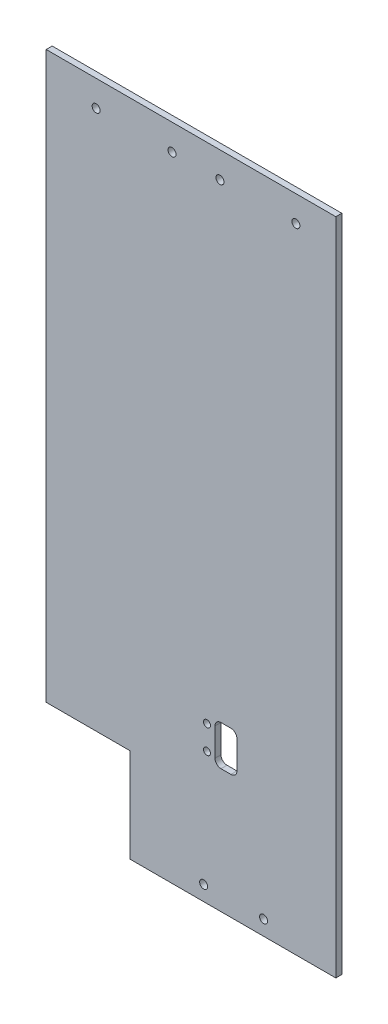
ISO-10303-21;
HEADER;
FILE_DESCRIPTION(('STEP AP214'),'2;1');
FILE_NAME('part.step','',(''),(''),'','','');
FILE_SCHEMA(('AUTOMOTIVE_DESIGN { 1 0 10303 214 1 1 1 1 }'));
ENDSEC;
DATA;
#1=APPLICATION_CONTEXT('core data for automotive mechanical design processes');
#2=APPLICATION_PROTOCOL_DEFINITION('international standard','automotive_design',2000,#1);
#3=PRODUCT_CONTEXT('',#1,'mechanical');
#4=PRODUCT('Part','Part','',(#3));
#5=PRODUCT_RELATED_PRODUCT_CATEGORY('part','',(#4));
#6=PRODUCT_DEFINITION_FORMATION('','',#4);
#7=PRODUCT_DEFINITION_CONTEXT('part definition',#1,'design');
#8=PRODUCT_DEFINITION('design','',#6,#7);
#9=PRODUCT_DEFINITION_SHAPE('','',#8);
#10=(LENGTH_UNIT() NAMED_UNIT(*) SI_UNIT(.MILLI.,.METRE.));
#11=(NAMED_UNIT(*) PLANE_ANGLE_UNIT() SI_UNIT($,.RADIAN.));
#12=(NAMED_UNIT(*) SI_UNIT($,.STERADIAN.) SOLID_ANGLE_UNIT());
#13=UNCERTAINTY_MEASURE_WITH_UNIT(LENGTH_MEASURE(1.E-05),#10,'distance_accuracy_value','');
#14=(GEOMETRIC_REPRESENTATION_CONTEXT(3) GLOBAL_UNCERTAINTY_ASSIGNED_CONTEXT((#13)) GLOBAL_UNIT_ASSIGNED_CONTEXT((#10,
#11,#12)) REPRESENTATION_CONTEXT('',''));
#15=CARTESIAN_POINT('',(0.,0.,0.));
#16=DIRECTION('',(0.,0.,1.));
#17=DIRECTION('',(1.,0.,0.));
#18=AXIS2_PLACEMENT_3D('',#15,#16,#17);
#19=CARTESIAN_POINT('',(-37.546991932126,-59.8387133322413,3.));
#20=DIRECTION('',(0.,1.,0.));
#21=DIRECTION('',(0.,0.,1.));
#22=AXIS2_PLACEMENT_3D('',#19,#20,#21);
#23=PLANE('',#22);
#24=DIRECTION('',(1.,0.,0.));
#25=VECTOR('',#24,1.);
#26=CARTESIAN_POINT('',(-37.546991932126,-59.8387133322413,3.));
#27=LINE('',#26,#25);
#28=CARTESIAN_POINT('',(14.4530080678726,-59.8387133322413,3.));
#29=VERTEX_POINT('',#28);
#30=CARTESIAN_POINT('',(117.453008067874,-59.8387133322413,3.));
#31=VERTEX_POINT('',#30);
#32=EDGE_CURVE('E227',#29,#31,#27,.T.);
#33=ORIENTED_EDGE('',*,*,#32,.F.);
#34=DIRECTION('',(0.,0.,1.));
#35=VECTOR('',#34,1.);
#36=CARTESIAN_POINT('',(14.4530080678726,-59.8387133322413,-7.));
#37=LINE('',#36,#35);
#38=CARTESIAN_POINT('',(14.4530080678726,-59.8387133322413,0.));
#39=VERTEX_POINT('',#38);
#40=EDGE_CURVE('E218',#39,#29,#37,.T.);
#41=ORIENTED_EDGE('',*,*,#40,.F.);
#42=DIRECTION('',(1.,0.,0.));
#43=VECTOR('',#42,1.);
#44=CARTESIAN_POINT('',(-37.546991932126,-59.8387133322413,0.));
#45=LINE('',#44,#43);
#46=CARTESIAN_POINT('',(117.453008067874,-59.8387133322413,0.));
#47=VERTEX_POINT('',#46);
#48=EDGE_CURVE('E220',#39,#47,#45,.T.);
#49=ORIENTED_EDGE('',*,*,#48,.T.);
#50=DIRECTION('',(0.,0.,-1.));
#51=VECTOR('',#50,1.);
#52=CARTESIAN_POINT('',(117.453008067874,-59.8387133322413,3.));
#53=LINE('',#52,#51);
#54=EDGE_CURVE('E243',#31,#47,#53,.T.);
#55=ORIENTED_EDGE('',*,*,#54,.F.);
#56=EDGE_LOOP('',(#33,#41,#49,#55));
#57=FACE_BOUND('',#56,.T.);
#58=ADVANCED_FACE('F33',(#57),#23,.F.);
#59=CARTESIAN_POINT('',(117.453008067874,270.161286667759,3.));
#60=DIRECTION('',(-1.,0.,0.));
#61=DIRECTION('',(0.,-1.,0.));
#62=AXIS2_PLACEMENT_3D('',#59,#60,#61);
#63=PLANE('',#62);
#64=DIRECTION('',(0.,1.,0.));
#65=VECTOR('',#64,1.);
#66=CARTESIAN_POINT('',(117.453008067874,270.161286667759,0.));
#67=LINE('',#66,#65);
#68=CARTESIAN_POINT('',(117.453008067874,270.161286667759,0.));
#69=VERTEX_POINT('',#68);
#70=EDGE_CURVE('E237',#47,#69,#67,.T.);
#71=ORIENTED_EDGE('',*,*,#70,.T.);
#72=DIRECTION('',(0.,0.,-1.));
#73=VECTOR('',#72,1.);
#74=CARTESIAN_POINT('',(117.453008067874,270.161286667759,3.));
#75=LINE('',#74,#73);
#76=CARTESIAN_POINT('',(117.453008067874,270.161286667759,3.));
#77=VERTEX_POINT('',#76);
#78=EDGE_CURVE('E235',#77,#69,#75,.T.);
#79=ORIENTED_EDGE('',*,*,#78,.F.);
#80=DIRECTION('',(0.,1.,0.));
#81=VECTOR('',#80,1.);
#82=CARTESIAN_POINT('',(117.453008067874,270.161286667759,3.));
#83=LINE('',#82,#81);
#84=EDGE_CURVE('E229',#31,#77,#83,.T.);
#85=ORIENTED_EDGE('',*,*,#84,.F.);
#86=ORIENTED_EDGE('',*,*,#54,.T.);
#87=EDGE_LOOP('',(#71,#79,#85,#86));
#88=FACE_BOUND('',#87,.T.);
#89=ADVANCED_FACE('F318',(#88),#63,.F.);
#90=CARTESIAN_POINT('',(-37.546991932126,270.161286667759,3.));
#91=DIRECTION('',(0.,-1.,0.));
#92=DIRECTION('',(0.,0.,-1.));
#93=AXIS2_PLACEMENT_3D('',#90,#91,#92);
#94=PLANE('',#93);
#95=DIRECTION('',(-1.,0.,0.));
#96=VECTOR('',#95,1.);
#97=CARTESIAN_POINT('',(-37.546991932126,270.161286667759,0.));
#98=LINE('',#97,#96);
#99=CARTESIAN_POINT('',(-27.546991932126,270.161286667759,0.));
#100=VERTEX_POINT('',#99);
#101=EDGE_CURVE('E230',#69,#100,#98,.T.);
#102=ORIENTED_EDGE('',*,*,#101,.T.);
#103=DIRECTION('',(0.,0.,1.));
#104=VECTOR('',#103,1.);
#105=CARTESIAN_POINT('',(-27.546991932126,270.161286667759,-7.));
#106=LINE('',#105,#104);
#107=CARTESIAN_POINT('',(-27.546991932126,270.161286667759,3.));
#108=VERTEX_POINT('',#107);
#109=EDGE_CURVE('E221',#100,#108,#106,.T.);
#110=ORIENTED_EDGE('',*,*,#109,.T.);
#111=DIRECTION('',(-1.,0.,0.));
#112=VECTOR('',#111,1.);
#113=CARTESIAN_POINT('',(-37.546991932126,270.161286667759,3.));
#114=LINE('',#113,#112);
#115=EDGE_CURVE('E232',#77,#108,#114,.T.);
#116=ORIENTED_EDGE('',*,*,#115,.F.);
#117=ORIENTED_EDGE('',*,*,#78,.T.);
#118=EDGE_LOOP('',(#102,#110,#116,#117));
#119=FACE_BOUND('',#118,.T.);
#120=ADVANCED_FACE('F323',(#119),#94,.F.);
#121=CARTESIAN_POINT('',(0.,0.,3.));
#122=DIRECTION('',(0.,0.,1.));
#123=DIRECTION('',(1.,0.,0.));
#124=AXIS2_PLACEMENT_3D('',#121,#122,#123);
#125=PLANE('',#124);
#126=CARTESIAN_POINT('',(52.953008067874,6.16128666775862,3.));
#127=DIRECTION('',(0.,0.,1.));
#128=DIRECTION('',(1.,0.,0.));
#129=AXIS2_PLACEMENT_3D('',#126,#127,#128);
#130=CIRCLE('',#129,1.75000000000001);
#131=CARTESIAN_POINT('',(54.703008067874,6.16128666775862,3.));
#132=VERTEX_POINT('',#131);
#133=EDGE_CURVE('E173',#132,#132,#130,.T.);
#134=ORIENTED_EDGE('',*,*,#133,.F.);
#135=EDGE_LOOP('',(#134));
#136=FACE_BOUND('',#135,.T.);
#137=CARTESIAN_POINT('',(59.953008067874,5.16128666775862,3.));
#138=DIRECTION('',(0.,0.,1.));
#139=DIRECTION('',(1.,0.,0.));
#140=AXIS2_PLACEMENT_3D('',#137,#138,#139);
#141=CIRCLE('',#140,3.00000000000001);
#142=CARTESIAN_POINT('',(56.953008067874,5.16128666775862,3.));
#143=VERTEX_POINT('',#142);
#144=CARTESIAN_POINT('',(59.953008067874,2.16128666775862,3.));
#145=VERTEX_POINT('',#144);
#146=EDGE_CURVE('E48',#143,#145,#141,.T.);
#147=ORIENTED_EDGE('',*,*,#146,.F.);
#148=DIRECTION('',(0.,-1.,0.));
#149=VECTOR('',#148,1.);
#150=CARTESIAN_POINT('',(56.953008067874,5.16128666775862,3.));
#151=LINE('',#150,#149);
#152=CARTESIAN_POINT('',(56.953008067874,19.1612866677586,3.));
#153=VERTEX_POINT('',#152);
#154=EDGE_CURVE('E168',#153,#143,#151,.T.);
#155=ORIENTED_EDGE('',*,*,#154,.F.);
#156=CARTESIAN_POINT('',(59.953008067874,19.1612866677586,3.));
#157=DIRECTION('',(0.,0.,1.));
#158=DIRECTION('',(-1.,0.,0.));
#159=AXIS2_PLACEMENT_3D('',#156,#157,#158);
#160=CIRCLE('',#159,3.);
#161=CARTESIAN_POINT('',(59.953008067874,22.1612866677586,3.));
#162=VERTEX_POINT('',#161);
#163=EDGE_CURVE('E165',#162,#153,#160,.T.);
#164=ORIENTED_EDGE('',*,*,#163,.F.);
#165=DIRECTION('',(-1.,0.,0.));
#166=VECTOR('',#165,1.);
#167=CARTESIAN_POINT('',(59.953008067874,22.1612866677586,3.));
#168=LINE('',#167,#166);
#169=CARTESIAN_POINT('',(64.953008067874,22.1612866677586,3.));
#170=VERTEX_POINT('',#169);
#171=EDGE_CURVE('E162',#170,#162,#168,.T.);
#172=ORIENTED_EDGE('',*,*,#171,.F.);
#173=CARTESIAN_POINT('',(64.953008067874,19.1612866677586,3.));
#174=DIRECTION('',(0.,0.,1.));
#175=DIRECTION('',(1.,0.,0.));
#176=AXIS2_PLACEMENT_3D('',#173,#174,#175);
#177=CIRCLE('',#176,2.99999999999999);
#178=CARTESIAN_POINT('',(67.953008067874,19.1612866677586,3.));
#179=VERTEX_POINT('',#178);
#180=EDGE_CURVE('E156',#179,#170,#177,.T.);
#181=ORIENTED_EDGE('',*,*,#180,.F.);
#182=DIRECTION('',(0.,1.,0.));
#183=VECTOR('',#182,1.);
#184=CARTESIAN_POINT('',(67.953008067874,5.16128666775862,3.));
#185=LINE('',#184,#183);
#186=CARTESIAN_POINT('',(67.953008067874,5.16128666775862,3.));
#187=VERTEX_POINT('',#186);
#188=EDGE_CURVE('E154',#187,#179,#185,.T.);
#189=ORIENTED_EDGE('',*,*,#188,.F.);
#190=CARTESIAN_POINT('',(64.953008067874,5.16128666775862,3.));
#191=DIRECTION('',(0.,0.,1.));
#192=DIRECTION('',(1.,0.,0.));
#193=AXIS2_PLACEMENT_3D('',#190,#191,#192);
#194=CIRCLE('',#193,2.99999999999999);
#195=CARTESIAN_POINT('',(64.953008067874,2.16128666775863,3.));
#196=VERTEX_POINT('',#195);
#197=EDGE_CURVE('E137',#196,#187,#194,.T.);
#198=ORIENTED_EDGE('',*,*,#197,.F.);
#199=DIRECTION('',(1.,0.,0.));
#200=VECTOR('',#199,1.);
#201=CARTESIAN_POINT('',(59.953008067874,2.16128666775862,3.));
#202=LINE('',#201,#200);
#203=EDGE_CURVE('E146',#145,#196,#202,.T.);
#204=ORIENTED_EDGE('',*,*,#203,.F.);
#205=EDGE_LOOP('',(#147,#155,#164,#172,#181,#189,#198,#204));
#206=FACE_BOUND('',#205,.T.);
#207=CARTESIAN_POINT('',(52.953008067874,18.1612866677586,3.));
#208=DIRECTION('',(0.,0.,1.));
#209=DIRECTION('',(1.,0.,0.));
#210=AXIS2_PLACEMENT_3D('',#207,#208,#209);
#211=CIRCLE('',#210,1.75000000000001);
#212=CARTESIAN_POINT('',(54.703008067874,18.1612866677586,3.));
#213=VERTEX_POINT('',#212);
#214=EDGE_CURVE('E184',#213,#213,#211,.T.);
#215=ORIENTED_EDGE('',*,*,#214,.F.);
#216=EDGE_LOOP('',(#215));
#217=FACE_BOUND('',#216,.T.);
#218=CARTESIAN_POINT('',(97.4530080678732,257.161286667759,3.));
#219=DIRECTION('',(0.,0.,1.));
#220=DIRECTION('',(1.,0.,0.));
#221=AXIS2_PLACEMENT_3D('',#218,#219,#220);
#222=CIRCLE('',#221,2.);
#223=CARTESIAN_POINT('',(99.4530080678732,257.161286667759,3.));
#224=VERTEX_POINT('',#223);
#225=EDGE_CURVE('E195',#224,#224,#222,.T.);
#226=ORIENTED_EDGE('',*,*,#225,.F.);
#227=EDGE_LOOP('',(#226));
#228=FACE_BOUND('',#227,.T.);
#229=CARTESIAN_POINT('',(59.4530080678732,257.161286667759,3.));
#230=DIRECTION('',(0.,0.,1.));
#231=DIRECTION('',(1.,0.,0.));
#232=AXIS2_PLACEMENT_3D('',#229,#230,#231);
#233=CIRCLE('',#232,2.);
#234=CARTESIAN_POINT('',(61.4530080678732,257.161286667759,3.));
#235=VERTEX_POINT('',#234);
#236=EDGE_CURVE('E192',#235,#235,#233,.T.);
#237=ORIENTED_EDGE('',*,*,#236,.F.);
#238=EDGE_LOOP('',(#237));
#239=FACE_BOUND('',#238,.T.);
#240=CARTESIAN_POINT('',(35.4530080678746,257.161286667759,3.));
#241=DIRECTION('',(0.,0.,1.));
#242=DIRECTION('',(1.,0.,0.));
#243=AXIS2_PLACEMENT_3D('',#240,#241,#242);
#244=CIRCLE('',#243,2.);
#245=CARTESIAN_POINT('',(37.4530080678746,257.161286667759,3.));
#246=VERTEX_POINT('',#245);
#247=EDGE_CURVE('E188',#246,#246,#244,.T.);
#248=ORIENTED_EDGE('',*,*,#247,.F.);
#249=EDGE_LOOP('',(#248));
#250=FACE_BOUND('',#249,.T.);
#251=CARTESIAN_POINT('',(-2.54699193212542,257.161286667759,3.));
#252=DIRECTION('',(0.,0.,1.));
#253=DIRECTION('',(1.,0.,0.));
#254=AXIS2_PLACEMENT_3D('',#251,#252,#253);
#255=CIRCLE('',#254,2.);
#256=CARTESIAN_POINT('',(-0.546991932125414,257.161286667759,3.));
#257=VERTEX_POINT('',#256);
#258=EDGE_CURVE('E191',#257,#257,#255,.T.);
#259=ORIENTED_EDGE('',*,*,#258,.F.);
#260=EDGE_LOOP('',(#259));
#261=FACE_BOUND('',#260,.T.);
#262=CARTESIAN_POINT('',(81.2735161435602,-52.3387133322413,3.));
#263=DIRECTION('',(0.,0.,1.));
#264=DIRECTION('',(1.,0.,0.));
#265=AXIS2_PLACEMENT_3D('',#262,#263,#264);
#266=CIRCLE('',#265,2.);
#267=CARTESIAN_POINT('',(83.2735161435602,-52.3387133322413,3.));
#268=VERTEX_POINT('',#267);
#269=EDGE_CURVE('E198',#268,#268,#266,.T.);
#270=ORIENTED_EDGE('',*,*,#269,.F.);
#271=EDGE_LOOP('',(#270));
#272=FACE_BOUND('',#271,.T.);
#273=CARTESIAN_POINT('',(51.2735161435602,-52.3387133322413,3.));
#274=DIRECTION('',(0.,0.,1.));
#275=DIRECTION('',(1.,0.,0.));
#276=AXIS2_PLACEMENT_3D('',#273,#274,#275);
#277=CIRCLE('',#276,2.);
#278=CARTESIAN_POINT('',(53.2735161435602,-52.3387133322413,3.));
#279=VERTEX_POINT('',#278);
#280=EDGE_CURVE('E204',#279,#279,#277,.T.);
#281=ORIENTED_EDGE('',*,*,#280,.F.);
#282=EDGE_LOOP('',(#281));
#283=FACE_BOUND('',#282,.T.);
#284=DIRECTION('',(0.,1.,0.));
#285=VECTOR('',#284,1.);
#286=CARTESIAN_POINT('',(14.4530080678726,-12.8387133322414,3.));
#287=LINE('',#286,#285);
#288=CARTESIAN_POINT('',(14.4530080678726,-12.8387133322414,3.));
#289=VERTEX_POINT('',#288);
#290=EDGE_CURVE('E209',#29,#289,#287,.T.);
#291=ORIENTED_EDGE('',*,*,#290,.F.);
#292=ORIENTED_EDGE('',*,*,#32,.T.);
#293=ORIENTED_EDGE('',*,*,#84,.T.);
#294=ORIENTED_EDGE('',*,*,#115,.T.);
#295=DIRECTION('',(0.,1.,0.));
#296=VECTOR('',#295,1.);
#297=CARTESIAN_POINT('',(-27.546991932126,-12.8387133322414,3.));
#298=LINE('',#297,#296);
#299=CARTESIAN_POINT('',(-27.546991932126,-12.8387133322414,3.));
#300=VERTEX_POINT('',#299);
#301=EDGE_CURVE('E215',#300,#108,#298,.T.);
#302=ORIENTED_EDGE('',*,*,#301,.F.);
#303=DIRECTION('',(-1.,0.,0.));
#304=VECTOR('',#303,1.);
#305=CARTESIAN_POINT('',(14.4530080678726,-12.8387133322414,3.));
#306=LINE('',#305,#304);
#307=EDGE_CURVE('E212',#289,#300,#306,.T.);
#308=ORIENTED_EDGE('',*,*,#307,.F.);
#309=EDGE_LOOP('',(#291,#292,#293,#294,#302,#308));
#310=FACE_BOUND('',#309,.T.);
#311=ADVANCED_FACE('F150',(#136,#206,#217,#228,#239,#250,#261,#272,#283,#310),#125,.T.);
#312=CARTESIAN_POINT('',(0.,0.,0.));
#313=DIRECTION('',(0.,0.,1.));
#314=DIRECTION('',(1.,0.,0.));
#315=AXIS2_PLACEMENT_3D('',#312,#313,#314);
#316=PLANE('',#315);
#317=CARTESIAN_POINT('',(52.953008067874,6.16128666775862,0.));
#318=DIRECTION('',(0.,0.,1.));
#319=DIRECTION('',(1.,0.,0.));
#320=AXIS2_PLACEMENT_3D('',#317,#318,#319);
#321=CIRCLE('',#320,1.75000000000001);
#322=CARTESIAN_POINT('',(54.703008067874,6.16128666775862,0.));
#323=VERTEX_POINT('',#322);
#324=EDGE_CURVE('E36',#323,#323,#321,.T.);
#325=ORIENTED_EDGE('',*,*,#324,.T.);
#326=EDGE_LOOP('',(#325));
#327=FACE_BOUND('',#326,.T.);
#328=DIRECTION('',(0.,-1.,0.));
#329=VECTOR('',#328,1.);
#330=CARTESIAN_POINT('',(56.953008067874,0.,0.));
#331=LINE('',#330,#329);
#332=CARTESIAN_POINT('',(56.953008067874,19.1612866677586,0.));
#333=VERTEX_POINT('',#332);
#334=CARTESIAN_POINT('',(56.953008067874,5.16128666775862,0.));
#335=VERTEX_POINT('',#334);
#336=EDGE_CURVE('E41',#333,#335,#331,.T.);
#337=ORIENTED_EDGE('',*,*,#336,.T.);
#338=CARTESIAN_POINT('',(59.953008067874,5.16128666775862,0.));
#339=DIRECTION('',(0.,0.,1.));
#340=DIRECTION('',(1.,0.,0.));
#341=AXIS2_PLACEMENT_3D('',#338,#339,#340);
#342=CIRCLE('',#341,3.00000000000001);
#343=CARTESIAN_POINT('',(59.953008067874,2.16128666775862,0.));
#344=VERTEX_POINT('',#343);
#345=EDGE_CURVE('E11',#335,#344,#342,.T.);
#346=ORIENTED_EDGE('',*,*,#345,.T.);
#347=DIRECTION('',(1.,0.,0.));
#348=VECTOR('',#347,1.);
#349=CARTESIAN_POINT('',(0.,2.16128666775862,0.));
#350=LINE('',#349,#348);
#351=CARTESIAN_POINT('',(64.953008067874,2.16128666775862,0.));
#352=VERTEX_POINT('',#351);
#353=EDGE_CURVE('E255',#344,#352,#350,.T.);
#354=ORIENTED_EDGE('',*,*,#353,.T.);
#355=CARTESIAN_POINT('',(64.953008067874,5.16128666775862,0.));
#356=DIRECTION('',(0.,0.,1.));
#357=DIRECTION('',(1.,0.,0.));
#358=AXIS2_PLACEMENT_3D('',#355,#356,#357);
#359=CIRCLE('',#358,2.99999999999999);
#360=CARTESIAN_POINT('',(67.953008067874,5.16128666775862,0.));
#361=VERTEX_POINT('',#360);
#362=EDGE_CURVE('E140',#352,#361,#359,.T.);
#363=ORIENTED_EDGE('',*,*,#362,.T.);
#364=DIRECTION('',(0.,1.,0.));
#365=VECTOR('',#364,1.);
#366=CARTESIAN_POINT('',(67.953008067874,0.,0.));
#367=LINE('',#366,#365);
#368=CARTESIAN_POINT('',(67.953008067874,19.1612866677586,0.));
#369=VERTEX_POINT('',#368);
#370=EDGE_CURVE('E275',#361,#369,#367,.T.);
#371=ORIENTED_EDGE('',*,*,#370,.T.);
#372=CARTESIAN_POINT('',(64.953008067874,19.1612866677586,0.));
#373=DIRECTION('',(0.,0.,1.));
#374=DIRECTION('',(1.,0.,0.));
#375=AXIS2_PLACEMENT_3D('',#372,#373,#374);
#376=CIRCLE('',#375,2.99999999999999);
#377=CARTESIAN_POINT('',(64.953008067874,22.1612866677586,0.));
#378=VERTEX_POINT('',#377);
#379=EDGE_CURVE('E278',#369,#378,#376,.T.);
#380=ORIENTED_EDGE('',*,*,#379,.T.);
#381=DIRECTION('',(-1.,0.,0.));
#382=VECTOR('',#381,1.);
#383=CARTESIAN_POINT('',(0.,22.1612866677586,0.));
#384=LINE('',#383,#382);
#385=CARTESIAN_POINT('',(59.953008067874,22.1612866677586,0.));
#386=VERTEX_POINT('',#385);
#387=EDGE_CURVE('E281',#378,#386,#384,.T.);
#388=ORIENTED_EDGE('',*,*,#387,.T.);
#389=CARTESIAN_POINT('',(59.953008067874,19.1612866677586,0.));
#390=DIRECTION('',(0.,0.,1.));
#391=DIRECTION('',(1.,0.,0.));
#392=AXIS2_PLACEMENT_3D('',#389,#390,#391);
#393=CIRCLE('',#392,3.);
#394=EDGE_CURVE('E284',#386,#333,#393,.T.);
#395=ORIENTED_EDGE('',*,*,#394,.T.);
#396=EDGE_LOOP('',(#337,#346,#354,#363,#371,#380,#388,#395));
#397=FACE_BOUND('',#396,.T.);
#398=CARTESIAN_POINT('',(52.953008067874,18.1612866677586,0.));
#399=DIRECTION('',(0.,0.,1.));
#400=DIRECTION('',(1.,0.,0.));
#401=AXIS2_PLACEMENT_3D('',#398,#399,#400);
#402=CIRCLE('',#401,1.75000000000001);
#403=CARTESIAN_POINT('',(54.703008067874,18.1612866677586,0.));
#404=VERTEX_POINT('',#403);
#405=EDGE_CURVE('E187',#404,#404,#402,.T.);
#406=ORIENTED_EDGE('',*,*,#405,.T.);
#407=EDGE_LOOP('',(#406));
#408=FACE_BOUND('',#407,.T.);
#409=CARTESIAN_POINT('',(97.4530080678732,257.161286667759,0.));
#410=DIRECTION('',(0.,0.,1.));
#411=DIRECTION('',(1.,0.,0.));
#412=AXIS2_PLACEMENT_3D('',#409,#410,#411);
#413=CIRCLE('',#412,2.);
#414=CARTESIAN_POINT('',(99.4530080678732,257.161286667759,0.));
#415=VERTEX_POINT('',#414);
#416=EDGE_CURVE('E208',#415,#415,#413,.T.);
#417=ORIENTED_EDGE('',*,*,#416,.T.);
#418=EDGE_LOOP('',(#417));
#419=FACE_BOUND('',#418,.T.);
#420=CARTESIAN_POINT('',(59.4530080678732,257.161286667759,0.));
#421=DIRECTION('',(0.,0.,1.));
#422=DIRECTION('',(1.,0.,0.));
#423=AXIS2_PLACEMENT_3D('',#420,#421,#422);
#424=CIRCLE('',#423,2.);
#425=CARTESIAN_POINT('',(61.4530080678732,257.161286667759,0.));
#426=VERTEX_POINT('',#425);
#427=EDGE_CURVE('E266',#426,#426,#424,.T.);
#428=ORIENTED_EDGE('',*,*,#427,.T.);
#429=EDGE_LOOP('',(#428));
#430=FACE_BOUND('',#429,.T.);
#431=CARTESIAN_POINT('',(35.4530080678746,257.161286667759,0.));
#432=DIRECTION('',(0.,0.,1.));
#433=DIRECTION('',(1.,0.,0.));
#434=AXIS2_PLACEMENT_3D('',#431,#432,#433);
#435=CIRCLE('',#434,2.);
#436=CARTESIAN_POINT('',(37.4530080678746,257.161286667759,0.));
#437=VERTEX_POINT('',#436);
#438=EDGE_CURVE('E263',#437,#437,#435,.T.);
#439=ORIENTED_EDGE('',*,*,#438,.T.);
#440=EDGE_LOOP('',(#439));
#441=FACE_BOUND('',#440,.T.);
#442=CARTESIAN_POINT('',(-2.54699193212542,257.161286667759,0.));
#443=DIRECTION('',(0.,0.,1.));
#444=DIRECTION('',(1.,0.,0.));
#445=AXIS2_PLACEMENT_3D('',#442,#443,#444);
#446=CIRCLE('',#445,2.);
#447=CARTESIAN_POINT('',(-0.546991932125414,257.161286667759,0.));
#448=VERTEX_POINT('',#447);
#449=EDGE_CURVE('E260',#448,#448,#446,.T.);
#450=ORIENTED_EDGE('',*,*,#449,.T.);
#451=EDGE_LOOP('',(#450));
#452=FACE_BOUND('',#451,.T.);
#453=CARTESIAN_POINT('',(81.2735161435602,-52.3387133322413,0.));
#454=DIRECTION('',(0.,0.,1.));
#455=DIRECTION('',(1.,0.,0.));
#456=AXIS2_PLACEMENT_3D('',#453,#454,#455);
#457=CIRCLE('',#456,2.);
#458=CARTESIAN_POINT('',(83.2735161435602,-52.3387133322413,0.));
#459=VERTEX_POINT('',#458);
#460=EDGE_CURVE('E201',#459,#459,#457,.T.);
#461=ORIENTED_EDGE('',*,*,#460,.T.);
#462=EDGE_LOOP('',(#461));
#463=FACE_BOUND('',#462,.T.);
#464=CARTESIAN_POINT('',(51.2735161435602,-52.3387133322413,0.));
#465=DIRECTION('',(0.,0.,1.));
#466=DIRECTION('',(1.,0.,0.));
#467=AXIS2_PLACEMENT_3D('',#464,#465,#466);
#468=CIRCLE('',#467,2.);
#469=CARTESIAN_POINT('',(53.2735161435602,-52.3387133322413,0.));
#470=VERTEX_POINT('',#469);
#471=EDGE_CURVE('E207',#470,#470,#468,.T.);
#472=ORIENTED_EDGE('',*,*,#471,.T.);
#473=EDGE_LOOP('',(#472));
#474=FACE_BOUND('',#473,.T.);
#475=ORIENTED_EDGE('',*,*,#48,.F.);
#476=DIRECTION('',(0.,1.,0.));
#477=VECTOR('',#476,1.);
#478=CARTESIAN_POINT('',(14.4530080678726,0.,0.));
#479=LINE('',#478,#477);
#480=CARTESIAN_POINT('',(14.4530080678726,-12.8387133322414,0.));
#481=VERTEX_POINT('',#480);
#482=EDGE_CURVE('E252',#39,#481,#479,.T.);
#483=ORIENTED_EDGE('',*,*,#482,.T.);
#484=DIRECTION('',(-1.,0.,0.));
#485=VECTOR('',#484,1.);
#486=CARTESIAN_POINT('',(0.,-12.8387133322414,0.));
#487=LINE('',#486,#485);
#488=CARTESIAN_POINT('',(-27.546991932126,-12.8387133322414,0.));
#489=VERTEX_POINT('',#488);
#490=EDGE_CURVE('E246',#481,#489,#487,.T.);
#491=ORIENTED_EDGE('',*,*,#490,.T.);
#492=DIRECTION('',(0.,1.,0.));
#493=VECTOR('',#492,1.);
#494=CARTESIAN_POINT('',(-27.546991932126,0.,0.));
#495=LINE('',#494,#493);
#496=EDGE_CURVE('E249',#489,#100,#495,.T.);
#497=ORIENTED_EDGE('',*,*,#496,.T.);
#498=ORIENTED_EDGE('',*,*,#101,.F.);
#499=ORIENTED_EDGE('',*,*,#70,.F.);
#500=EDGE_LOOP('',(#475,#483,#491,#497,#498,#499));
#501=FACE_BOUND('',#500,.T.);
#502=ADVANCED_FACE('F289',(#327,#397,#408,#419,#430,#441,#452,#463,#474,#501),#316,.F.);
#503=CARTESIAN_POINT('',(14.4530080678726,-12.8387133322414,-7.));
#504=DIRECTION('',(1.,0.,0.));
#505=DIRECTION('',(0.,0.,-1.));
#506=AXIS2_PLACEMENT_3D('',#503,#504,#505);
#507=PLANE('',#506);
#508=ORIENTED_EDGE('',*,*,#40,.T.);
#509=ORIENTED_EDGE('',*,*,#290,.T.);
#510=DIRECTION('',(0.,0.,1.));
#511=VECTOR('',#510,1.);
#512=CARTESIAN_POINT('',(14.4530080678726,-12.8387133322414,-7.));
#513=LINE('',#512,#511);
#514=EDGE_CURVE('E217',#481,#289,#513,.T.);
#515=ORIENTED_EDGE('',*,*,#514,.F.);
#516=ORIENTED_EDGE('',*,*,#482,.F.);
#517=EDGE_LOOP('',(#508,#509,#515,#516));
#518=FACE_BOUND('',#517,.T.);
#519=ADVANCED_FACE('F337',(#518),#507,.F.);
#520=CARTESIAN_POINT('',(-27.546991932126,-12.8387133322414,-7.));
#521=DIRECTION('',(1.,0.,0.));
#522=DIRECTION('',(0.,0.,-1.));
#523=AXIS2_PLACEMENT_3D('',#520,#521,#522);
#524=PLANE('',#523);
#525=DIRECTION('',(0.,0.,1.));
#526=VECTOR('',#525,1.);
#527=CARTESIAN_POINT('',(-27.546991932126,-12.8387133322414,-7.));
#528=LINE('',#527,#526);
#529=EDGE_CURVE('E224',#489,#300,#528,.T.);
#530=ORIENTED_EDGE('',*,*,#529,.T.);
#531=ORIENTED_EDGE('',*,*,#301,.T.);
#532=ORIENTED_EDGE('',*,*,#109,.F.);
#533=ORIENTED_EDGE('',*,*,#496,.F.);
#534=EDGE_LOOP('',(#530,#531,#532,#533));
#535=FACE_BOUND('',#534,.T.);
#536=ADVANCED_FACE('F344',(#535),#524,.F.);
#537=CARTESIAN_POINT('',(14.4530080678726,-12.8387133322414,-7.));
#538=DIRECTION('',(0.,1.,0.));
#539=DIRECTION('',(-1.,0.,0.));
#540=AXIS2_PLACEMENT_3D('',#537,#538,#539);
#541=PLANE('',#540);
#542=ORIENTED_EDGE('',*,*,#514,.T.);
#543=ORIENTED_EDGE('',*,*,#307,.T.);
#544=ORIENTED_EDGE('',*,*,#529,.F.);
#545=ORIENTED_EDGE('',*,*,#490,.F.);
#546=EDGE_LOOP('',(#542,#543,#544,#545));
#547=FACE_BOUND('',#546,.T.);
#548=ADVANCED_FACE('F347',(#547),#541,.F.);
#549=CARTESIAN_POINT('',(51.2735161435602,-52.3387133322413,-7.));
#550=DIRECTION('',(0.,0.,1.));
#551=DIRECTION('',(1.,0.,0.));
#552=AXIS2_PLACEMENT_3D('',#549,#550,#551);
#553=CYLINDRICAL_SURFACE('',#552,2.);
#554=ORIENTED_EDGE('',*,*,#280,.T.);
#555=EDGE_LOOP('',(#554));
#556=FACE_BOUND('',#555,.T.);
#557=ORIENTED_EDGE('',*,*,#471,.F.);
#558=EDGE_LOOP('',(#557));
#559=FACE_BOUND('',#558,.T.);
#560=ADVANCED_FACE('F349',(#556,#559),#553,.F.);
#561=CARTESIAN_POINT('',(81.2735161435602,-52.3387133322413,-7.));
#562=DIRECTION('',(0.,0.,1.));
#563=DIRECTION('',(1.,0.,0.));
#564=AXIS2_PLACEMENT_3D('',#561,#562,#563);
#565=CYLINDRICAL_SURFACE('',#564,2.);
#566=ORIENTED_EDGE('',*,*,#269,.T.);
#567=EDGE_LOOP('',(#566));
#568=FACE_BOUND('',#567,.T.);
#569=ORIENTED_EDGE('',*,*,#460,.F.);
#570=EDGE_LOOP('',(#569));
#571=FACE_BOUND('',#570,.T.);
#572=ADVANCED_FACE('F355',(#568,#571),#565,.F.);
#573=CARTESIAN_POINT('',(-2.54699193212542,257.161286667759,-7.));
#574=DIRECTION('',(0.,0.,1.));
#575=DIRECTION('',(1.,0.,0.));
#576=AXIS2_PLACEMENT_3D('',#573,#574,#575);
#577=CYLINDRICAL_SURFACE('',#576,2.);
#578=ORIENTED_EDGE('',*,*,#258,.T.);
#579=EDGE_LOOP('',(#578));
#580=FACE_BOUND('',#579,.T.);
#581=ORIENTED_EDGE('',*,*,#449,.F.);
#582=EDGE_LOOP('',(#581));
#583=FACE_BOUND('',#582,.T.);
#584=ADVANCED_FACE('F409',(#580,#583),#577,.F.);
#585=CARTESIAN_POINT('',(35.4530080678746,257.161286667759,-7.));
#586=DIRECTION('',(0.,0.,1.));
#587=DIRECTION('',(1.,0.,0.));
#588=AXIS2_PLACEMENT_3D('',#585,#586,#587);
#589=CYLINDRICAL_SURFACE('',#588,2.);
#590=ORIENTED_EDGE('',*,*,#247,.T.);
#591=EDGE_LOOP('',(#590));
#592=FACE_BOUND('',#591,.T.);
#593=ORIENTED_EDGE('',*,*,#438,.F.);
#594=EDGE_LOOP('',(#593));
#595=FACE_BOUND('',#594,.T.);
#596=ADVANCED_FACE('F419',(#592,#595),#589,.F.);
#597=CARTESIAN_POINT('',(59.4530080678732,257.161286667759,-7.));
#598=DIRECTION('',(0.,0.,1.));
#599=DIRECTION('',(1.,0.,0.));
#600=AXIS2_PLACEMENT_3D('',#597,#598,#599);
#601=CYLINDRICAL_SURFACE('',#600,2.);
#602=ORIENTED_EDGE('',*,*,#236,.T.);
#603=EDGE_LOOP('',(#602));
#604=FACE_BOUND('',#603,.T.);
#605=ORIENTED_EDGE('',*,*,#427,.F.);
#606=EDGE_LOOP('',(#605));
#607=FACE_BOUND('',#606,.T.);
#608=ADVANCED_FACE('F429',(#604,#607),#601,.F.);
#609=CARTESIAN_POINT('',(97.4530080678732,257.161286667759,-7.));
#610=DIRECTION('',(0.,0.,1.));
#611=DIRECTION('',(1.,0.,0.));
#612=AXIS2_PLACEMENT_3D('',#609,#610,#611);
#613=CYLINDRICAL_SURFACE('',#612,2.);
#614=ORIENTED_EDGE('',*,*,#225,.T.);
#615=EDGE_LOOP('',(#614));
#616=FACE_BOUND('',#615,.T.);
#617=ORIENTED_EDGE('',*,*,#416,.F.);
#618=EDGE_LOOP('',(#617));
#619=FACE_BOUND('',#618,.T.);
#620=ADVANCED_FACE('F438',(#616,#619),#613,.F.);
#621=CARTESIAN_POINT('',(52.953008067874,18.1612866677586,-7.));
#622=DIRECTION('',(0.,0.,1.));
#623=DIRECTION('',(1.,0.,0.));
#624=AXIS2_PLACEMENT_3D('',#621,#622,#623);
#625=CYLINDRICAL_SURFACE('',#624,1.75000000000001);
#626=ORIENTED_EDGE('',*,*,#214,.T.);
#627=EDGE_LOOP('',(#626));
#628=FACE_BOUND('',#627,.T.);
#629=ORIENTED_EDGE('',*,*,#405,.F.);
#630=EDGE_LOOP('',(#629));
#631=FACE_BOUND('',#630,.T.);
#632=ADVANCED_FACE('F447',(#628,#631),#625,.F.);
#633=CARTESIAN_POINT('',(59.953008067874,5.16128666775862,-7.));
#634=DIRECTION('',(0.,0.,1.));
#635=DIRECTION('',(1.,0.,0.));
#636=AXIS2_PLACEMENT_3D('',#633,#634,#635);
#637=CYLINDRICAL_SURFACE('',#636,3.00000000000001);
#638=DIRECTION('',(0.,0.,1.));
#639=VECTOR('',#638,1.);
#640=CARTESIAN_POINT('',(56.953008067874,5.16128666775862,-7.));
#641=LINE('',#640,#639);
#642=EDGE_CURVE('E171',#335,#143,#641,.T.);
#643=ORIENTED_EDGE('',*,*,#642,.T.);
#644=ORIENTED_EDGE('',*,*,#146,.T.);
#645=DIRECTION('',(0.,0.,1.));
#646=VECTOR('',#645,1.);
#647=CARTESIAN_POINT('',(59.953008067874,2.16128666775862,-7.));
#648=LINE('',#647,#646);
#649=EDGE_CURVE('E143',#344,#145,#648,.T.);
#650=ORIENTED_EDGE('',*,*,#649,.F.);
#651=ORIENTED_EDGE('',*,*,#345,.F.);
#652=EDGE_LOOP('',(#643,#644,#650,#651));
#653=FACE_BOUND('',#652,.T.);
#654=ADVANCED_FACE('F457',(#653),#637,.F.);
#655=CARTESIAN_POINT('',(56.953008067874,5.16128666775862,-7.));
#656=DIRECTION('',(-1.,0.,0.));
#657=DIRECTION('',(0.,0.,1.));
#658=AXIS2_PLACEMENT_3D('',#655,#656,#657);
#659=PLANE('',#658);
#660=DIRECTION('',(0.,0.,1.));
#661=VECTOR('',#660,1.);
#662=CARTESIAN_POINT('',(56.953008067874,19.1612866677586,-7.));
#663=LINE('',#662,#661);
#664=EDGE_CURVE('E174',#333,#153,#663,.T.);
#665=ORIENTED_EDGE('',*,*,#664,.T.);
#666=ORIENTED_EDGE('',*,*,#154,.T.);
#667=ORIENTED_EDGE('',*,*,#642,.F.);
#668=ORIENTED_EDGE('',*,*,#336,.F.);
#669=EDGE_LOOP('',(#665,#666,#667,#668));
#670=FACE_BOUND('',#669,.T.);
#671=ADVANCED_FACE('F294',(#670),#659,.F.);
#672=CARTESIAN_POINT('',(59.953008067874,19.1612866677586,-7.));
#673=DIRECTION('',(0.,0.,1.));
#674=DIRECTION('',(1.,0.,0.));
#675=AXIS2_PLACEMENT_3D('',#672,#673,#674);
#676=CYLINDRICAL_SURFACE('',#675,3.);
#677=DIRECTION('',(0.,0.,1.));
#678=VECTOR('',#677,1.);
#679=CARTESIAN_POINT('',(59.953008067874,22.1612866677586,-7.));
#680=LINE('',#679,#678);
#681=EDGE_CURVE('E176',#386,#162,#680,.T.);
#682=ORIENTED_EDGE('',*,*,#681,.T.);
#683=ORIENTED_EDGE('',*,*,#163,.T.);
#684=ORIENTED_EDGE('',*,*,#664,.F.);
#685=ORIENTED_EDGE('',*,*,#394,.F.);
#686=EDGE_LOOP('',(#682,#683,#684,#685));
#687=FACE_BOUND('',#686,.T.);
#688=ADVANCED_FACE('F296',(#687),#676,.F.);
#689=CARTESIAN_POINT('',(59.953008067874,22.1612866677586,-7.));
#690=DIRECTION('',(0.,1.,0.));
#691=DIRECTION('',(0.,0.,1.));
#692=AXIS2_PLACEMENT_3D('',#689,#690,#691);
#693=PLANE('',#692);
#694=DIRECTION('',(0.,0.,1.));
#695=VECTOR('',#694,1.);
#696=CARTESIAN_POINT('',(64.953008067874,22.1612866677586,-7.));
#697=LINE('',#696,#695);
#698=EDGE_CURVE('E178',#378,#170,#697,.T.);
#699=ORIENTED_EDGE('',*,*,#698,.T.);
#700=ORIENTED_EDGE('',*,*,#171,.T.);
#701=ORIENTED_EDGE('',*,*,#681,.F.);
#702=ORIENTED_EDGE('',*,*,#387,.F.);
#703=EDGE_LOOP('',(#699,#700,#701,#702));
#704=FACE_BOUND('',#703,.T.);
#705=ADVANCED_FACE('F475',(#704),#693,.F.);
#706=CARTESIAN_POINT('',(64.953008067874,19.1612866677586,-7.));
#707=DIRECTION('',(0.,0.,1.));
#708=DIRECTION('',(1.,0.,0.));
#709=AXIS2_PLACEMENT_3D('',#706,#707,#708);
#710=CYLINDRICAL_SURFACE('',#709,2.99999999999999);
#711=DIRECTION('',(0.,0.,1.));
#712=VECTOR('',#711,1.);
#713=CARTESIAN_POINT('',(67.953008067874,19.1612866677586,-7.));
#714=LINE('',#713,#712);
#715=EDGE_CURVE('E180',#369,#179,#714,.T.);
#716=ORIENTED_EDGE('',*,*,#715,.T.);
#717=ORIENTED_EDGE('',*,*,#180,.T.);
#718=ORIENTED_EDGE('',*,*,#698,.F.);
#719=ORIENTED_EDGE('',*,*,#379,.F.);
#720=EDGE_LOOP('',(#716,#717,#718,#719));
#721=FACE_BOUND('',#720,.T.);
#722=ADVANCED_FACE('F482',(#721),#710,.F.);
#723=CARTESIAN_POINT('',(67.953008067874,5.16128666775862,-7.));
#724=DIRECTION('',(1.,0.,0.));
#725=DIRECTION('',(0.,1.,0.));
#726=AXIS2_PLACEMENT_3D('',#723,#724,#725);
#727=PLANE('',#726);
#728=DIRECTION('',(0.,0.,1.));
#729=VECTOR('',#728,1.);
#730=CARTESIAN_POINT('',(67.953008067874,5.16128666775862,-7.));
#731=LINE('',#730,#729);
#732=EDGE_CURVE('E142',#361,#187,#731,.T.);
#733=ORIENTED_EDGE('',*,*,#732,.T.);
#734=ORIENTED_EDGE('',*,*,#188,.T.);
#735=ORIENTED_EDGE('',*,*,#715,.F.);
#736=ORIENTED_EDGE('',*,*,#370,.F.);
#737=EDGE_LOOP('',(#733,#734,#735,#736));
#738=FACE_BOUND('',#737,.T.);
#739=ADVANCED_FACE('F490',(#738),#727,.F.);
#740=CARTESIAN_POINT('',(64.953008067874,5.16128666775862,-7.));
#741=DIRECTION('',(0.,0.,1.));
#742=DIRECTION('',(1.,0.,0.));
#743=AXIS2_PLACEMENT_3D('',#740,#741,#742);
#744=CYLINDRICAL_SURFACE('',#743,2.99999999999999);
#745=DIRECTION('',(0.,0.,1.));
#746=VECTOR('',#745,1.);
#747=CARTESIAN_POINT('',(64.953008067874,2.16128666775863,-7.));
#748=LINE('',#747,#746);
#749=EDGE_CURVE('E56',#352,#196,#748,.T.);
#750=ORIENTED_EDGE('',*,*,#749,.T.);
#751=ORIENTED_EDGE('',*,*,#197,.T.);
#752=ORIENTED_EDGE('',*,*,#732,.F.);
#753=ORIENTED_EDGE('',*,*,#362,.F.);
#754=EDGE_LOOP('',(#750,#751,#752,#753));
#755=FACE_BOUND('',#754,.T.);
#756=ADVANCED_FACE('F134',(#755),#744,.F.);
#757=CARTESIAN_POINT('',(59.953008067874,2.16128666775862,-7.));
#758=DIRECTION('',(0.,-1.,0.));
#759=DIRECTION('',(0.,0.,-1.));
#760=AXIS2_PLACEMENT_3D('',#757,#758,#759);
#761=PLANE('',#760);
#762=ORIENTED_EDGE('',*,*,#649,.T.);
#763=ORIENTED_EDGE('',*,*,#203,.T.);
#764=ORIENTED_EDGE('',*,*,#749,.F.);
#765=ORIENTED_EDGE('',*,*,#353,.F.);
#766=EDGE_LOOP('',(#762,#763,#764,#765));
#767=FACE_BOUND('',#766,.T.);
#768=ADVANCED_FACE('F147',(#767),#761,.F.);
#769=CARTESIAN_POINT('',(52.953008067874,6.16128666775862,-7.));
#770=DIRECTION('',(0.,0.,1.));
#771=DIRECTION('',(1.,0.,0.));
#772=AXIS2_PLACEMENT_3D('',#769,#770,#771);
#773=CYLINDRICAL_SURFACE('',#772,1.75000000000001);
#774=ORIENTED_EDGE('',*,*,#133,.T.);
#775=EDGE_LOOP('',(#774));
#776=FACE_BOUND('',#775,.T.);
#777=ORIENTED_EDGE('',*,*,#324,.F.);
#778=EDGE_LOOP('',(#777));
#779=FACE_BOUND('',#778,.T.);
#780=ADVANCED_FACE('F309',(#776,#779),#773,.F.);
#781=CLOSED_SHELL('',(#58,#89,#120,#311,#502,#519,#536,#548,#560,#572,#584,#596,#608,#620,#632,
#654,#671,#688,#705,#722,#739,#756,#768,#780));
#782=MANIFOLD_SOLID_BREP('B2',#781);
#783=ADVANCED_BREP_SHAPE_REPRESENTATION('',(#18,#782),#14);
#784=SHAPE_DEFINITION_REPRESENTATION(#9,#783);
ENDSEC;
END-ISO-10303-21;
